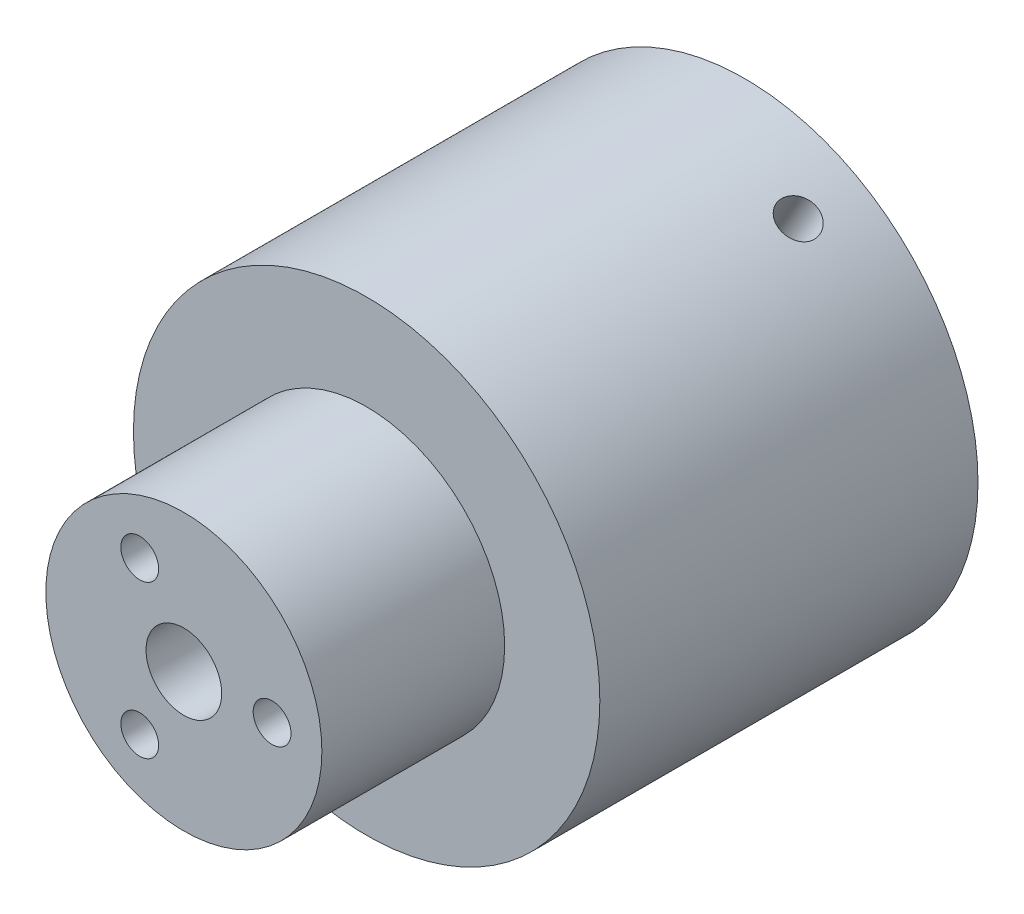
ISO-10303-21;
HEADER;
FILE_DESCRIPTION(('STEP AP214'),'2;1');
FILE_NAME('part.step','',(''),(''),'','','');
FILE_SCHEMA(('AUTOMOTIVE_DESIGN { 1 0 10303 214 1 1 1 1 }'));
ENDSEC;
DATA;
#1=APPLICATION_CONTEXT('core data for automotive mechanical design processes');
#2=APPLICATION_PROTOCOL_DEFINITION('international standard','automotive_design',2000,#1);
#3=PRODUCT_CONTEXT('',#1,'mechanical');
#4=PRODUCT('Part','Part','',(#3));
#5=PRODUCT_RELATED_PRODUCT_CATEGORY('part','',(#4));
#6=PRODUCT_DEFINITION_FORMATION('','',#4);
#7=PRODUCT_DEFINITION_CONTEXT('part definition',#1,'design');
#8=PRODUCT_DEFINITION('design','',#6,#7);
#9=PRODUCT_DEFINITION_SHAPE('','',#8);
#10=(LENGTH_UNIT() NAMED_UNIT(*) SI_UNIT(.MILLI.,.METRE.));
#11=(NAMED_UNIT(*) PLANE_ANGLE_UNIT() SI_UNIT($,.RADIAN.));
#12=(NAMED_UNIT(*) SI_UNIT($,.STERADIAN.) SOLID_ANGLE_UNIT());
#13=UNCERTAINTY_MEASURE_WITH_UNIT(LENGTH_MEASURE(1.E-05),#10,'distance_accuracy_value','');
#14=(GEOMETRIC_REPRESENTATION_CONTEXT(3) GLOBAL_UNCERTAINTY_ASSIGNED_CONTEXT((#13)) GLOBAL_UNIT_ASSIGNED_CONTEXT((#10,
#11,#12)) REPRESENTATION_CONTEXT('',''));
#15=CARTESIAN_POINT('',(0.,0.,0.));
#16=DIRECTION('',(0.,0.,1.));
#17=DIRECTION('',(1.,0.,0.));
#18=AXIS2_PLACEMENT_3D('',#15,#16,#17);
#19=CARTESIAN_POINT('',(-3.49999999999994,6.06217782649111,0.));
#20=DIRECTION('',(0.,0.,1.));
#21=DIRECTION('',(1.,0.,0.));
#22=AXIS2_PLACEMENT_3D('',#19,#20,#21);
#23=CYLINDRICAL_SURFACE('',#22,1.5);
#24=CARTESIAN_POINT('',(-3.49999999999994,6.06217782649111,37.5));
#25=DIRECTION('',(0.,0.,1.));
#26=DIRECTION('',(1.,0.,0.));
#27=AXIS2_PLACEMENT_3D('',#24,#25,#26);
#28=CIRCLE('',#27,1.5);
#29=CARTESIAN_POINT('',(-1.99999999999994,6.06217782649111,37.5));
#30=VERTEX_POINT('',#29);
#31=EDGE_CURVE('E183',#30,#30,#28,.T.);
#32=ORIENTED_EDGE('',*,*,#31,.T.);
#33=EDGE_LOOP('',(#32));
#34=FACE_BOUND('',#33,.T.);
#35=CARTESIAN_POINT('',(-3.49999999999994,6.06217782649111,30.));
#36=DIRECTION('',(0.,0.,-1.));
#37=DIRECTION('',(-1.,0.,0.));
#38=AXIS2_PLACEMENT_3D('',#35,#36,#37);
#39=CIRCLE('',#38,1.5);
#40=CARTESIAN_POINT('',(-4.99999999999994,6.06217782649111,30.));
#41=VERTEX_POINT('',#40);
#42=EDGE_CURVE('E70',#41,#41,#39,.F.);
#43=ORIENTED_EDGE('',*,*,#42,.F.);
#44=EDGE_LOOP('',(#43));
#45=FACE_BOUND('',#44,.T.);
#46=ADVANCED_FACE('F40',(#34,#45),#23,.F.);
#47=CARTESIAN_POINT('',(-3.50000000000003,-6.06217782649106,0.));
#48=DIRECTION('',(0.,0.,1.));
#49=DIRECTION('',(1.,0.,0.));
#50=AXIS2_PLACEMENT_3D('',#47,#48,#49);
#51=CYLINDRICAL_SURFACE('',#50,1.5);
#52=CARTESIAN_POINT('',(-3.50000000000003,-6.06217782649106,37.5));
#53=DIRECTION('',(0.,0.,1.));
#54=DIRECTION('',(1.,0.,0.));
#55=AXIS2_PLACEMENT_3D('',#52,#53,#54);
#56=CIRCLE('',#55,1.5);
#57=CARTESIAN_POINT('',(-2.00000000000003,-6.06217782649106,37.5));
#58=VERTEX_POINT('',#57);
#59=EDGE_CURVE('E188',#58,#58,#56,.T.);
#60=ORIENTED_EDGE('',*,*,#59,.T.);
#61=EDGE_LOOP('',(#60));
#62=FACE_BOUND('',#61,.T.);
#63=CARTESIAN_POINT('',(-3.50000000000003,-6.06217782649106,30.));
#64=DIRECTION('',(0.,0.,-1.));
#65=DIRECTION('',(-1.,0.,0.));
#66=AXIS2_PLACEMENT_3D('',#63,#64,#65);
#67=CIRCLE('',#66,1.5);
#68=CARTESIAN_POINT('',(-5.00000000000003,-6.06217782649106,30.));
#69=VERTEX_POINT('',#68);
#70=EDGE_CURVE('E66',#69,#69,#67,.F.);
#71=ORIENTED_EDGE('',*,*,#70,.F.);
#72=EDGE_LOOP('',(#71));
#73=FACE_BOUND('',#72,.T.);
#74=ADVANCED_FACE('F126',(#62,#73),#51,.F.);
#75=CARTESIAN_POINT('',(7.,0.,0.));
#76=DIRECTION('',(0.,0.,1.));
#77=DIRECTION('',(1.,0.,0.));
#78=AXIS2_PLACEMENT_3D('',#75,#76,#77);
#79=CYLINDRICAL_SURFACE('',#78,1.5);
#80=CARTESIAN_POINT('',(7.,0.,37.5));
#81=DIRECTION('',(0.,0.,1.));
#82=DIRECTION('',(1.,0.,0.));
#83=AXIS2_PLACEMENT_3D('',#80,#81,#82);
#84=CIRCLE('',#83,1.5);
#85=CARTESIAN_POINT('',(8.5,0.,37.5));
#86=VERTEX_POINT('',#85);
#87=EDGE_CURVE('E184',#86,#86,#84,.T.);
#88=ORIENTED_EDGE('',*,*,#87,.T.);
#89=EDGE_LOOP('',(#88));
#90=FACE_BOUND('',#89,.T.);
#91=CARTESIAN_POINT('',(7.,0.,30.));
#92=DIRECTION('',(0.,0.,-1.));
#93=DIRECTION('',(-1.,0.,0.));
#94=AXIS2_PLACEMENT_3D('',#91,#92,#93);
#95=CIRCLE('',#94,1.5);
#96=CARTESIAN_POINT('',(5.5,0.,30.));
#97=VERTEX_POINT('',#96);
#98=EDGE_CURVE('E63',#97,#97,#95,.F.);
#99=ORIENTED_EDGE('',*,*,#98,.F.);
#100=EDGE_LOOP('',(#99));
#101=FACE_BOUND('',#100,.T.);
#102=ADVANCED_FACE('F123',(#90,#101),#79,.F.);
#103=CARTESIAN_POINT('',(0.,0.,23.));
#104=DIRECTION('',(0.,0.,-1.));
#105=DIRECTION('',(-1.,0.,0.));
#106=AXIS2_PLACEMENT_3D('',#103,#104,#105);
#107=CYLINDRICAL_SURFACE('',#106,18.5);
#108=CARTESIAN_POINT('',(7.92050635161631,-16.7187194226713,-2.));
#109=CARTESIAN_POINT('',(7.920509940493,-16.7187182836103,-1.91589305238285));
#110=CARTESIAN_POINT('',(7.92694403159106,-16.7156742636564,-1.83172864688561));
#111=CARTESIAN_POINT('',(7.95249244942322,-16.7035342412793,-1.66572797712148));
#112=CARTESIAN_POINT('',(7.9716211916323,-16.6944313586494,-1.58389447002247));
#113=CARTESIAN_POINT('',(8.0219311386824,-16.6703147645035,-1.42498390631009));
#114=CARTESIAN_POINT('',(8.05310556804115,-16.6553043757654,-1.34790420398026));
#115=CARTESIAN_POINT('',(8.12650110386516,-16.6196160290497,-1.20064883417398));
#116=CARTESIAN_POINT('',(8.16871982826437,-16.5989392931607,-1.13047168242074));
#117=CARTESIAN_POINT('',(8.26298202865537,-16.5522171582038,-0.998823863895051));
#118=CARTESIAN_POINT('',(8.31504653305869,-16.5261602571446,-0.937372334215012));
#119=CARTESIAN_POINT('',(8.42732993336261,-16.4691853276837,-0.825084489746075));
#120=CARTESIAN_POINT('',(8.48754918334156,-16.4382670881938,-0.774248636132708));
#121=CARTESIAN_POINT('',(8.61439315523093,-16.3721515046297,-0.684571953396852));
#122=CARTESIAN_POINT('',(8.68102652188289,-16.3369483681291,-0.645747618398881));
#123=CARTESIAN_POINT('',(8.81862225676852,-16.2630867948194,-0.581301563704662));
#124=CARTESIAN_POINT('',(8.88958455280365,-16.2244284156325,-0.555679623884151));
#125=CARTESIAN_POINT('',(9.03357297272146,-16.1446992272974,-0.518420583859927));
#126=CARTESIAN_POINT('',(9.10659417234366,-16.1036339564812,-0.506752605386653));
#127=CARTESIAN_POINT('',(9.25272916089057,-16.0201149957479,-0.497637255511902));
#128=CARTESIAN_POINT('',(9.32584294815306,-15.9776613304262,-0.500189632332508));
#129=CARTESIAN_POINT('',(9.46991615707652,-15.8926922867784,-0.519417262399528));
#130=CARTESIAN_POINT('',(9.54088023810902,-15.8501772879836,-0.536059309799018));
#131=CARTESIAN_POINT('',(9.67888062735782,-15.7662866552721,-0.582942254568614));
#132=CARTESIAN_POINT('',(9.74591689989028,-15.7249110317084,-0.613183275462702));
#133=CARTESIAN_POINT('',(9.87434542109148,-15.6445854015982,-0.686442816683035));
#134=CARTESIAN_POINT('',(9.9357309814641,-15.6056382866286,-0.729476230001792));
#135=CARTESIAN_POINT('',(10.0511746963178,-15.5315356607769,-0.827088180090581));
#136=CARTESIAN_POINT('',(10.105232710188,-15.4963802226572,-0.881666938356818));
#137=CARTESIAN_POINT('',(10.2047926465065,-15.4310003661968,-1.00100748557717));
#138=CARTESIAN_POINT('',(10.2502695011575,-15.4007904279779,-1.06579812433811));
#139=CARTESIAN_POINT('',(10.331331866677,-15.3465295388471,-1.20362265870703));
#140=CARTESIAN_POINT('',(10.3669173700086,-15.3224785926281,-1.27665656059611));
#141=CARTESIAN_POINT('',(10.4273143197703,-15.281441555506,-1.42891454938799));
#142=CARTESIAN_POINT('',(10.4521245367051,-15.2644562708273,-1.50813934147531));
#143=CARTESIAN_POINT('',(10.4903467812982,-15.2382140238459,-1.67052066634596));
#144=CARTESIAN_POINT('',(10.5037590356439,-15.2289569078422,-1.75367712090002));
#145=CARTESIAN_POINT('',(10.5188301381156,-15.2185511087797,-1.92130804135632));
#146=CARTESIAN_POINT('',(10.5205223105851,-15.2173794359771,-2.00577808529532));
#147=CARTESIAN_POINT('',(10.5121995978079,-15.2231299082596,-2.17386086811142));
#148=CARTESIAN_POINT('',(10.5021848158491,-15.2300519819355,-2.25747361454572));
#149=CARTESIAN_POINT('',(10.47071850858,-15.2517020055878,-2.42135270374156));
#150=CARTESIAN_POINT('',(10.4492825572841,-15.2664193257319,-2.50162344337553));
#151=CARTESIAN_POINT('',(10.3955129021972,-15.3030834877141,-2.65667606888866));
#152=CARTESIAN_POINT('',(10.3631790327212,-15.3250304394668,-2.73145787129651));
#153=CARTESIAN_POINT('',(10.2883270996331,-15.3753815193488,-2.87359459297397));
#154=CARTESIAN_POINT('',(10.245786286936,-15.4038000639659,-2.94093242445872));
#155=CARTESIAN_POINT('',(10.1516190510955,-15.4660210479399,-3.0660970962305));
#156=CARTESIAN_POINT('',(10.0999924798696,-15.4998235750457,-3.12392378147214));
#157=CARTESIAN_POINT('',(9.9888272479967,-15.5716958909536,-3.22856224316261));
#158=CARTESIAN_POINT('',(9.92927027750794,-15.6097755219709,-3.27534781296246));
#159=CARTESIAN_POINT('',(9.80388522466343,-15.6888278642772,-3.35639621977992));
#160=CARTESIAN_POINT('',(9.73805720210339,-15.7298005479795,-3.39065917618804));
#161=CARTESIAN_POINT('',(9.60197050185944,-15.8132387544076,-3.44564467919343));
#162=CARTESIAN_POINT('',(9.53171725374305,-15.8557024204877,-3.46638347770085));
#163=CARTESIAN_POINT('',(9.38864013639583,-15.940839470571,-3.49378509166462));
#164=CARTESIAN_POINT('',(9.31581631299369,-15.9835128508236,-3.50044815793696));
#165=CARTESIAN_POINT('',(9.1698661448514,-16.0676890630386,-3.49950630926112));
#166=CARTESIAN_POINT('',(9.09674126656109,-16.1091949008849,-3.49194225635862));
#167=CARTESIAN_POINT('',(8.95208489584881,-16.19002914799,-3.46284603750625));
#168=CARTESIAN_POINT('',(8.88055340568351,-16.2293575541651,-3.44131385177489));
#169=CARTESIAN_POINT('',(8.74118322236748,-16.3048459586161,-3.38490284718542));
#170=CARTESIAN_POINT('',(8.67334434310311,-16.341006116633,-3.35002470169831));
#171=CARTESIAN_POINT('',(8.54337335935332,-16.4093317679929,-3.26791659890986));
#172=CARTESIAN_POINT('',(8.48124115766924,-16.441497329377,-3.22068685203921));
#173=CARTESIAN_POINT('',(8.3643953745659,-16.5012489116383,-3.11506295314024));
#174=CARTESIAN_POINT('',(8.3097025545615,-16.5288221627443,-3.05663861029896));
#175=CARTESIAN_POINT('',(8.20961014796169,-16.5787646995041,-2.93033750255217));
#176=CARTESIAN_POINT('',(8.16421281796173,-16.6011327217036,-2.86245844910254));
#177=CARTESIAN_POINT('',(8.08408209713078,-16.6403009474743,-2.71904972320095));
#178=CARTESIAN_POINT('',(8.04936799305311,-16.6570910854131,-2.6435065374776));
#179=CARTESIAN_POINT('',(7.99185990263305,-16.6847596075977,-2.48706416249895));
#180=CARTESIAN_POINT('',(7.96905218069001,-16.6956448045514,-2.4061712668252));
#181=CARTESIAN_POINT('',(7.94191399298116,-16.708564625058,-2.27066576296071));
#182=CARTESIAN_POINT('',(7.93389792917545,-16.712369648398,-2.21692522868833));
#183=CARTESIAN_POINT('',(7.92319295433397,-16.7174474124593,-2.1087978108073));
#184=CARTESIAN_POINT('',(7.92050402988047,-16.7187201595589,-2.05441092882698));
#185=CARTESIAN_POINT('',(7.92050635161631,-16.7187194226713,-2.));
#186=B_SPLINE_CURVE_WITH_KNOTS('',3,(#108,#109,#110,#111,#112,#113,#114,#115,#116,#117,#118,
#119,#120,#121,#122,#123,#124,#125,#126,#127,#128,#129,#130,#131,#132,#133,#134,#135,#136,#137,
#138,#139,#140,#141,#142,#143,#144,#145,#146,#147,#148,#149,#150,#151,#152,#153,#154,#155,#156,
#157,#158,#159,#160,#161,#162,#163,#164,#165,#166,#167,#168,#169,#170,#171,#172,#173,#174,#175,
#176,#177,#178,#179,#180,#181,#182,#183,#184,#185),.UNSPECIFIED.,.T.,.F.,(4,2,2,2,2,2,2,2,2,2,2,
2,2,2,2,2,2,2,2,2,2,2,2,2,2,2,2,2,2,2,2,2,2,2,2,2,2,2,4),(0.,0.252122182136554,
0.504531153893085,0.756798356335798,1.00901119384165,1.26176891370995,1.514537611818,
1.76765188493349,2.02076193772417,2.2733108489173,2.52585528863026,2.7778061954557,
3.02975939088097,3.28200706847211,3.53425958584686,3.78723796107974,4.04021652907545,
4.2932239551731,4.54622634923481,4.79850907147351,5.05078956789491,5.30272692938966,
5.55466812134959,5.80717613928723,6.05968827306149,6.31279386103382,6.56589703583611,
6.81869549463585,7.07148944877263,7.32355845589836,7.57562782000174,7.82768446761067,
8.07973682128258,8.33247875663575,8.58528197567228,8.83853894639373,9.09150310212679,
9.25460778074668,9.41771204854603),.UNSPECIFIED.);
#187=CARTESIAN_POINT('',(7.92050635161631,-16.7187194226713,-2.));
#188=VERTEX_POINT('',#187);
#189=EDGE_CURVE('E45',#188,#188,#186,.T.);
#190=ORIENTED_EDGE('',*,*,#189,.T.);
#191=EDGE_LOOP('',(#190));
#192=FACE_BOUND('',#191,.T.);
#193=CARTESIAN_POINT('',(10.5185825629694,15.2187194226714,-2.));
#194=CARTESIAN_POINT('',(10.5185797820753,15.2187219611993,-1.91589305238285));
#195=CARTESIAN_POINT('',(10.5127265379166,15.2227720375635,-1.83172864688561));
#196=CARTESIAN_POINT('',(10.4894387612194,15.2388276052441,-1.66572797712148));
#197=CARTESIAN_POINT('',(10.4719910625097,15.2508421406247,-1.58389447002247));
#198=CARTESIAN_POINT('',(10.4259505058016,15.2823535357602,-1.42498390631009));
#199=CARTESIAN_POINT('',(10.3973639131543,15.3018461891643,-1.34790420398026));
#200=CARTESIAN_POINT('',(10.3297591303674,15.3475644143544,-1.20064883417398));
#201=CARTESIAN_POINT('',(10.2907431896206,15.373788534255,-1.13047168242074));
#202=CARTESIAN_POINT('',(10.2031495336334,15.4320609269318,-0.998823863895052));
#203=CARTESIAN_POINT('',(10.1545513431705,15.4641216598509,-0.937372334215012));
#204=CARTESIAN_POINT('',(10.0490679067266,15.5328744722069,-0.825084489746075));
#205=CARTESIAN_POINT('',(9.99218230089864,15.5695667527406,-0.774248636132708));
#206=CARTESIAN_POINT('',(9.87150254000142,15.6463590629317,-0.684571953396852));
#207=CARTESIAN_POINT('',(9.80769904617297,15.6864636829416,-0.645747618398881));
#208=CARTESIAN_POINT('',(9.67493517988051,15.7686942981501,-0.581301563704663));
#209=CARTESIAN_POINT('',(9.60597489341794,15.810820259634,-0.555679623884151));
#210=CARTESIAN_POINT('',(9.46493318093773,15.895653294966,-0.518420583859926));
#211=CARTESIAN_POINT('',(9.39285901338653,15.9383588734456,-0.506752605386652));
#212=CARTESIAN_POINT('',(9.24746197742036,16.0231560055423,-0.497637255511902));
#213=CARTESIAN_POINT('',(9.17413913113674,16.0652475700176,-0.500189632332508));
#214=CARTESIAN_POINT('',(9.02851717634079,16.1475341071262,-0.519417262399528));
#215=CARTESIAN_POINT('',(8.95621606682639,16.1877333046592,-0.536059309799018));
#216=CARTESIAN_POINT('',(8.81456445313428,16.265299831125,-0.582942254568613));
#217=CARTESIAN_POINT('',(8.74521397576441,16.3026671343313,-0.613183275462701));
#218=CARTESIAN_POINT('',(8.6114356789134,16.3737266812069,-0.686442816683035));
#219=CARTESIAN_POINT('',(8.54701370775933,16.4074145784304,-0.729476230001792));
#220=CARTESIAN_POINT('',(8.42511709385775,16.470340455275,-0.827088180090581));
#221=CARTESIAN_POINT('',(8.3676425844298,16.499578349505,-0.881666938356817));
#222=CARTESIAN_POINT('',(8.26124199968003,16.5531098553257,-1.00100748557716));
#223=CARTESIAN_POINT('',(8.21234099841028,16.5773889976282,-1.06579812433811));
#224=CARTESIAN_POINT('',(8.12481850723128,16.6204606208936,-1.20362265870703));
#225=CARTESIAN_POINT('',(8.08619702515477,16.6392530976757,-1.27665656059611));
#226=CARTESIAN_POINT('',(8.02045943363014,16.6710398719194,-1.42891454938799));
#227=CARTESIAN_POINT('',(7.9933446371405,16.684033507719,-1.50813934147531));
#228=CARTESIAN_POINT('',(7.95150706230569,16.7040138190355,-1.67052066634596));
#229=CARTESIAN_POINT('',(7.93678403750782,16.7110006140191,-1.75367712090002));
#230=CARTESIAN_POINT('',(7.92023679993723,16.7188496720914,-1.92130804135632));
#231=CARTESIAN_POINT('',(7.91837601529046,16.7197293000362,-2.00577808529532));
#232=CARTESIAN_POINT('',(7.92751742675949,16.7153968554841,-2.17386086811143));
#233=CARTESIAN_POINT('',(7.93851950938908,16.7101848367323,-2.25747361454572));
#234=CARTESIAN_POINT('',(7.97300213349905,16.6937592271001,-2.42135270374156));
#235=CARTESIAN_POINT('',(7.99646568226737,16.6825538087956,-2.50162344337553));
#236=CARTESIAN_POINT('',(8.05510260549592,16.6543200025287,-2.65667606888866));
#237=CARTESIAN_POINT('',(8.09027615798736,16.6372915260363,-2.73145787129651));
#238=CARTESIAN_POINT('',(8.17130743881718,16.5976433904006,-2.87359459297397));
#239=CARTESIAN_POINT('',(8.21718902674273,16.5750112382158,-2.94093242445872));
#240=CARTESIAN_POINT('',(8.31815759743289,16.5245705117608,-3.0660970962305));
#241=CARTESIAN_POINT('',(8.37324473023163,16.4967618531218,-3.12392378147214));
#242=CARTESIAN_POINT('',(8.49107059757317,16.4364260962562,-3.22856224316261));
#243=CARTESIAN_POINT('',(8.55382701064521,16.4038880623491,-3.27534781296246));
#244=CARTESIAN_POINT('',(8.68498087373343,16.3348275924841,-3.35639621977992));
#245=CARTESIAN_POINT('',(8.75337826996087,16.2983051945173,-3.39065917618804));
#246=CARTESIAN_POINT('',(8.89368122649581,16.2221697582029,-3.44564467919343));
#247=CARTESIAN_POINT('',(8.9655824641172,16.1825604936758,-3.46638347770085));
#248=CARTESIAN_POINT('',(9.11085187096617,16.1012206003945,-3.49378509166462));
#249=CARTESIAN_POINT('',(9.18422001403139,16.0594900094539,-3.50044815793696));
#250=CARTESIAN_POINT('',(9.33009383627505,15.9751815622635,-3.49950630926112));
#251=CARTESIAN_POINT('',(9.40260138540043,15.9326064789386,-3.49194225635862));
#252=CARTESIAN_POINT('',(9.54493408224539,15.8477475106351,-3.46284603750625));
#253=CARTESIAN_POINT('',(9.61475922616602,15.8054636260689,-3.44131385177489));
#254=CARTESIAN_POINT('',(9.74981919376976,15.7225097090126,-3.38490284718542));
#255=CARTESIAN_POINT('',(9.81505424884944,15.6818395952139,-3.35002470169831));
#256=CARTESIAN_POINT('',(9.93921149053217,15.6034442472117,-3.26791659890986));
#257=CARTESIAN_POINT('',(9.9981337846598,15.5657189628522,-3.2206868520392));
#258=CARTESIAN_POINT('',(10.1083030643661,15.4944033374903,-3.11506295314024));
#259=CARTESIAN_POINT('',(10.159528610291,15.4608245915149,-3.05663861029896));
#260=CARTESIAN_POINT('',(10.2528263191543,15.3991132930535,-2.93033750255217));
#261=CARTESIAN_POINT('',(10.2948962596115,15.3709820631093,-2.86245844910254));
#262=CARTESIAN_POINT('',(10.3688822985656,15.3211709361314,-2.71904972320095));
#263=CARTESIAN_POINT('',(10.4007800365924,15.2995027090999,-2.6435065374776));
#264=CARTESIAN_POINT('',(10.4534957248995,15.2635335029653,-2.48706416249895));
#265=CARTESIAN_POINT('',(10.4743264429581,15.2492240348371,-2.40617126682519));
#266=CARTESIAN_POINT('',(10.4990844295836,15.2321815851218,-2.27066576296071));
#267=CARTESIAN_POINT('',(10.5063877083609,15.2271419818977,-2.21692522868833));
#268=CARTESIAN_POINT('',(10.5161376684532,15.2204100837688,-2.1087978108073));
#269=CARTESIAN_POINT('',(10.5185843620007,15.218717780433,-2.05441092882698));
#270=CARTESIAN_POINT('',(10.5185825629694,15.2187194226714,-2.));
#271=B_SPLINE_CURVE_WITH_KNOTS('',3,(#193,#194,#195,#196,#197,#198,#199,#200,#201,#202,#203,
#204,#205,#206,#207,#208,#209,#210,#211,#212,#213,#214,#215,#216,#217,#218,#219,#220,#221,#222,
#223,#224,#225,#226,#227,#228,#229,#230,#231,#232,#233,#234,#235,#236,#237,#238,#239,#240,#241,
#242,#243,#244,#245,#246,#247,#248,#249,#250,#251,#252,#253,#254,#255,#256,#257,#258,#259,#260,
#261,#262,#263,#264,#265,#266,#267,#268,#269,#270),.UNSPECIFIED.,.T.,.F.,(4,2,2,2,2,2,2,2,2,2,2,
2,2,2,2,2,2,2,2,2,2,2,2,2,2,2,2,2,2,2,2,2,2,2,2,2,2,2,4),(0.,0.252122182136554,
0.504531153893085,0.756798356335799,1.00901119384165,1.26176891370994,1.514537611818,
1.76765188493349,2.02076193772417,2.2733108489173,2.52585528863026,2.7778061954557,
3.02975939088097,3.2820070684721,3.53425958584686,3.78723796107974,4.04021652907545,
4.2932239551731,4.54622634923481,4.79850907147351,5.05078956789491,5.30272692938966,
5.55466812134959,5.80717613928722,6.05968827306148,6.31279386103382,6.5658970358361,
6.81869549463585,7.07148944877263,7.32355845589836,7.57562782000174,7.82768446761067,
8.07973682128258,8.33247875663574,8.58528197567228,8.83853894639373,9.09150310212679,
9.25460778074668,9.41771204854603),.UNSPECIFIED.);
#272=CARTESIAN_POINT('',(10.5185825629694,15.2187194226714,-2.));
#273=VERTEX_POINT('',#272);
#274=EDGE_CURVE('E82',#273,#273,#271,.T.);
#275=ORIENTED_EDGE('',*,*,#274,.T.);
#276=EDGE_LOOP('',(#275));
#277=FACE_BOUND('',#276,.T.);
#278=CARTESIAN_POINT('',(-18.5,0.,-0.500000000000002));
#279=CARTESIAN_POINT('',(-18.4999992018386,-0.0841074600240858,-0.500003677126895));
#280=CARTESIAN_POINT('',(-18.49942031025,-0.168272376255621,-0.507097856961772));
#281=CARTESIAN_POINT('',(-18.4971666549999,-0.334274107221221,-0.535293808922716));
#282=CARTESIAN_POINT('',(-18.4954906456848,-0.416108165187959,-0.556411503564231));
#283=CARTESIAN_POINT('',(-18.4912321771331,-0.575019893548109,-0.612040302131251));
#284=CARTESIAN_POINT('',(-18.488650226645,-0.652100204992827,-0.64654389010083));
#285=CARTESIAN_POINT('',(-18.4828695305308,-0.799356594754252,-0.72795174726246));
#286=CARTESIAN_POINT('',(-18.4796709180124,-0.869534158112596,-0.774853341133831));
#287=CARTESIAN_POINT('',(-18.4730072385833,-1.00118150919002,-0.879848613224292));
#288=CARTESIAN_POINT('',(-18.4695416147041,-1.06263229082474,-0.937966088789517));
#289=CARTESIAN_POINT('',(-18.4627391922885,-1.17491869232043,-1.06369320005692));
#290=CARTESIAN_POINT('',(-18.4594023993818,-1.2257538487126,-1.13130324998106));
#291=CARTESIAN_POINT('',(-18.4532293906448,-1.31542980445019,-1.27421073449909));
#292=CARTESIAN_POINT('',(-18.4503938708621,-1.35425398103888,-1.34951863269072));
#293=CARTESIAN_POINT('',(-18.4455507283819,-1.41869970374439,-1.50561112922273));
#294=CARTESIAN_POINT('',(-18.4435430917625,-1.44432147188073,-1.58639563543936));
#295=CARTESIAN_POINT('',(-18.4405876379152,-1.48158015006174,-1.7509583551443));
#296=CARTESIAN_POINT('',(-18.4396374820103,-1.4932479244156,-1.83472953794888));
#297=CARTESIAN_POINT('',(-18.4388971512574,-1.50236275051092,-2.0030462829829));
#298=CARTESIAN_POINT('',(-18.4391069556935,-1.49981005621559,-2.08759183135603));
#299=CARTESIAN_POINT('',(-18.440660717717,-1.48058192581961,-2.25484600580532));
#300=CARTESIAN_POINT('',(-18.4420019829606,-1.46394001507811,-2.33755851457945));
#301=CARTESIAN_POINT('',(-18.4456633111963,-1.41705792947881,-2.49901236912521));
#302=CARTESIAN_POINT('',(-18.4479833833004,-1.38681762802737,-2.57775367791953));
#303=CARTESIAN_POINT('',(-18.4533440042758,-1.3135595716986,-2.7291369025526));
#304=CARTESIAN_POINT('',(-18.456385401562,-1.27052675518137,-2.80177149843279));
#305=CARTESIAN_POINT('',(-18.4628451854293,-1.17291607630135,-2.93879942206624));
#306=CARTESIAN_POINT('',(-18.4662635792315,-1.11833799277576,-3.00319259190761));
#307=CARTESIAN_POINT('',(-18.4731041550355,-0.998997921290517,-3.12210472497058));
#308=CARTESIAN_POINT('',(-18.4765263194163,-0.934206946496951,-3.17659460229634));
#309=CARTESIAN_POINT('',(-18.4829794102491,-0.796381456947068,-3.27392856181887));
#310=CARTESIAN_POINT('',(-18.4860103364576,-0.72334693706089,-3.31677263676854));
#311=CARTESIAN_POINT('',(-18.4913399763367,-0.571088786957947,-3.38959691604859));
#312=CARTESIAN_POINT('',(-18.4936386179699,-0.491864548790936,-3.4195758548911));
#313=CARTESIAN_POINT('',(-18.4972438513764,-0.329484427021322,-3.46579861992925));
#314=CARTESIAN_POINT('',(-18.4985504626397,-0.246328620694753,-3.48204271596854));
#315=CARTESIAN_POINT('',(-18.5000219120631,-0.078697992068915,-3.50029827017414));
#316=CARTESIAN_POINT('',(-18.5001899735125,0.00577242742720614,-3.50234990822105));
#317=CARTESIAN_POINT('',(-18.4993739916585,0.173856042607109,-3.49226753191298));
#318=CARTESIAN_POINT('',(-18.4983899585204,0.257469245847823,-3.4801336427215));
#319=CARTESIAN_POINT('',(-18.495382540036,0.421350558055178,-3.44205794682921));
#320=CARTESIAN_POINT('',(-18.4933605549502,0.501623016566481,-3.41613474105266));
#321=CARTESIAN_POINT('',(-18.4885044160699,0.656678872821625,-3.35123526186494));
#322=CARTESIAN_POINT('',(-18.4856702500991,0.731462188249673,-3.31225879275434));
#323=CARTESIAN_POINT('',(-18.4794995137225,0.873599925942357,-3.22225805364098));
#324=CARTESIAN_POINT('',(-18.4761618381982,0.940937428102478,-3.17120713873549));
#325=CARTESIAN_POINT('',(-18.4693628625451,1.06610133368472,-3.05854518129713));
#326=CARTESIAN_POINT('',(-18.4659015603836,1.12392758063525,-2.99693396506863));
#327=CARTESIAN_POINT('',(-18.4592359229661,1.22856511642573,-2.86472608670604));
#328=CARTESIAN_POINT('',(-18.4560322106203,1.27535020395855,-2.79410865147966));
#329=CARTESIAN_POINT('',(-18.4502531976971,1.35639776419443,-2.64599642528607));
#330=CARTESIAN_POINT('',(-18.4476778911333,1.39066035619648,-2.56850169984599));
#331=CARTESIAN_POINT('',(-18.4434506960258,1.44564561352028,-2.40892781502757));
#332=CARTESIAN_POINT('',(-18.4417977102096,1.46638437294225,-2.32685423153443));
#333=CARTESIAN_POINT('',(-18.4395985923444,1.49378568743103,-2.16037591293555));
#334=CARTESIAN_POINT('',(-18.4390524402998,1.5004484967879,-2.07597121997053));
#335=CARTESIAN_POINT('',(-18.439129098025,1.4995059076103,-1.90748701844209));
#336=CARTESIAN_POINT('',(-18.4397485348113,1.49194167933729,-1.82340727494692));
#337=CARTESIAN_POINT('',(-18.4420794105417,1.46284552444752,-1.65771645815518));
#338=CARTESIAN_POINT('',(-18.443790851196,1.44131357595534,-1.57610538872511));
#339=CARTESIAN_POINT('',(-18.4481120145893,1.38490349674601,-1.41766548330881));
#340=CARTESIAN_POINT('',(-18.4507216915667,1.35002604592053,-1.34083640393408));
#341=CARTESIAN_POINT('',(-18.4565453445918,1.26791970089686,-1.19411749893485));
#342=CARTESIAN_POINT('',(-18.459759310408,1.22069101582014,-1.12422755584993));
#343=CARTESIAN_POINT('',(-18.4664404468683,1.1150682747765,-0.993160271760562));
#344=CARTESIAN_POINT('',(-18.4699082913633,1.05664378585471,-0.932007490158073));
#345=CARTESIAN_POINT('',(-18.4767003111364,0.930342064543588,-0.820352140426872));
#346=CARTESIAN_POINT('',(-18.4800244514024,0.862462545344835,-0.769852156253509));
#347=CARTESIAN_POINT('',(-18.4861601929444,0.719053450028474,-0.680872027125138));
#348=CARTESIAN_POINT('',(-18.4889708694003,0.643510444069051,-0.642413483285792));
#349=CARTESIAN_POINT('',(-18.4937520078942,0.487068452403801,-0.578775370558669));
#350=CARTESIAN_POINT('',(-18.4957234374669,0.406175759180912,-0.553580502522848));
#351=CARTESIAN_POINT('',(-18.4980965732538,0.270669711012243,-0.523617652854907));
#352=CARTESIAN_POINT('',(-18.4988071182786,0.2169283889936,-0.514772765628119));
#353=CARTESIAN_POINT('',(-18.4997590892453,0.108799392427558,-0.502962757097846));
#354=CARTESIAN_POINT('',(-18.5000005163553,0.0544117194900214,-0.499997621152786));
#355=CARTESIAN_POINT('',(-18.5,0.,-0.500000000000002));
#356=B_SPLINE_CURVE_WITH_KNOTS('',3,(#278,#279,#280,#281,#282,#283,#284,#285,#286,#287,#288,
#289,#290,#291,#292,#293,#294,#295,#296,#297,#298,#299,#300,#301,#302,#303,#304,#305,#306,#307,
#308,#309,#310,#311,#312,#313,#314,#315,#316,#317,#318,#319,#320,#321,#322,#323,#324,#325,#326,
#327,#328,#329,#330,#331,#332,#333,#334,#335,#336,#337,#338,#339,#340,#341,#342,#343,#344,#345,
#346,#347,#348,#349,#350,#351,#352,#353,#354,#355),.UNSPECIFIED.,.T.,.F.,(4,2,2,2,2,2,2,2,2,2,2,
2,2,2,2,2,2,2,2,2,2,2,2,2,2,2,2,2,2,2,2,2,2,2,2,2,2,2,4),(0.,0.252123721168803,
0.504534198083481,0.75680315536181,1.00901772081216,1.26177342695931,1.51454016589054,
1.76765517578223,2.02076592900327,2.27331579457328,2.52586114987229,2.77780725581025,
3.02975570727832,3.28200198044324,3.53425308611153,3.78723348355258,4.04021403842129,
4.29321947219408,4.54621993514242,4.79850384117442,5.05078552124028,5.30272774893383,
5.55467375400919,5.80718100738505,6.05969241439369,6.31279715184359,6.56589947795907,
6.81870004610704,7.07149604722958,7.32356163154415,7.57562761062996,7.82768074982833,
8.07972962173552,8.33247360074612,8.58527881532491,8.83853497220858,9.09149836408137,
9.25460541012179,9.4177120499976),.UNSPECIFIED.);
#357=CARTESIAN_POINT('',(-18.5,0.,-0.500000000000002));
#358=VERTEX_POINT('',#357);
#359=EDGE_CURVE('E74',#358,#358,#356,.T.);
#360=ORIENTED_EDGE('',*,*,#359,.T.);
#361=EDGE_LOOP('',(#360));
#362=FACE_BOUND('',#361,.T.);
#363=CARTESIAN_POINT('',(0.,0.,23.));
#364=DIRECTION('',(0.,0.,1.));
#365=DIRECTION('',(1.,0.,0.));
#366=AXIS2_PLACEMENT_3D('',#363,#364,#365);
#367=CIRCLE('',#366,18.5);
#368=CARTESIAN_POINT('',(18.5,0.,23.));
#369=VERTEX_POINT('',#368);
#370=EDGE_CURVE('E53',#369,#369,#367,.T.);
#371=ORIENTED_EDGE('',*,*,#370,.F.);
#372=EDGE_LOOP('',(#371));
#373=FACE_BOUND('',#372,.T.);
#374=CARTESIAN_POINT('',(0.,0.,-7.));
#375=DIRECTION('',(0.,0.,-1.));
#376=DIRECTION('',(-1.,0.,0.));
#377=AXIS2_PLACEMENT_3D('',#374,#375,#376);
#378=CIRCLE('',#377,18.5);
#379=CARTESIAN_POINT('',(-18.5,0.,-7.));
#380=VERTEX_POINT('',#379);
#381=EDGE_CURVE('E164',#380,#380,#378,.T.);
#382=ORIENTED_EDGE('',*,*,#381,.F.);
#383=EDGE_LOOP('',(#382));
#384=FACE_BOUND('',#383,.T.);
#385=ADVANCED_FACE('F42',(#192,#277,#362,#373,#384),#107,.T.);
#386=CARTESIAN_POINT('',(0.,0.,23.));
#387=DIRECTION('',(0.,0.,1.));
#388=DIRECTION('',(1.,0.,0.));
#389=AXIS2_PLACEMENT_3D('',#386,#387,#388);
#390=PLANE('',#389);
#391=CARTESIAN_POINT('',(0.,0.,23.));
#392=DIRECTION('',(0.,0.,1.));
#393=DIRECTION('',(1.,0.,0.));
#394=AXIS2_PLACEMENT_3D('',#391,#392,#393);
#395=CIRCLE('',#394,10.95);
#396=CARTESIAN_POINT('',(10.95,0.,23.));
#397=VERTEX_POINT('',#396);
#398=EDGE_CURVE('E11',#397,#397,#395,.T.);
#399=ORIENTED_EDGE('',*,*,#398,.F.);
#400=EDGE_LOOP('',(#399));
#401=FACE_BOUND('',#400,.T.);
#402=ORIENTED_EDGE('',*,*,#370,.T.);
#403=EDGE_LOOP('',(#402));
#404=FACE_BOUND('',#403,.T.);
#405=ADVANCED_FACE('F151',(#401,#404),#390,.T.);
#406=CARTESIAN_POINT('',(0.,0.,26.5));
#407=DIRECTION('',(0.,0.,-1.));
#408=DIRECTION('',(-1.,0.,0.));
#409=AXIS2_PLACEMENT_3D('',#406,#407,#408);
#410=CYLINDRICAL_SURFACE('',#409,10.95);
#411=ORIENTED_EDGE('',*,*,#398,.T.);
#412=EDGE_LOOP('',(#411));
#413=FACE_BOUND('',#412,.T.);
#414=CARTESIAN_POINT('',(0.,0.,37.5));
#415=DIRECTION('',(0.,0.,1.));
#416=DIRECTION('',(1.,0.,0.));
#417=AXIS2_PLACEMENT_3D('',#414,#415,#416);
#418=CIRCLE('',#417,10.95);
#419=CARTESIAN_POINT('',(10.95,0.,37.5));
#420=VERTEX_POINT('',#419);
#421=EDGE_CURVE('E194',#420,#420,#418,.T.);
#422=ORIENTED_EDGE('',*,*,#421,.F.);
#423=EDGE_LOOP('',(#422));
#424=FACE_BOUND('',#423,.T.);
#425=ADVANCED_FACE('F148',(#413,#424),#410,.T.);
#426=CARTESIAN_POINT('',(0.,0.,4.1));
#427=DIRECTION('',(0.,0.,-1.));
#428=DIRECTION('',(-1.,0.,0.));
#429=AXIS2_PLACEMENT_3D('',#426,#427,#428);
#430=CYLINDRICAL_SURFACE('',#429,3.05);
#431=CARTESIAN_POINT('',(0.,0.,4.1));
#432=DIRECTION('',(0.,0.,-1.));
#433=DIRECTION('',(-1.,0.,0.));
#434=AXIS2_PLACEMENT_3D('',#431,#432,#433);
#435=CIRCLE('',#434,3.05);
#436=CARTESIAN_POINT('',(-3.05,0.,4.1));
#437=VERTEX_POINT('',#436);
#438=EDGE_CURVE('E58',#437,#437,#435,.T.);
#439=ORIENTED_EDGE('',*,*,#438,.F.);
#440=EDGE_LOOP('',(#439));
#441=FACE_BOUND('',#440,.T.);
#442=CARTESIAN_POINT('',(0.,0.,-7.));
#443=DIRECTION('',(0.,0.,-1.));
#444=DIRECTION('',(-1.,0.,0.));
#445=AXIS2_PLACEMENT_3D('',#442,#443,#444);
#446=CIRCLE('',#445,3.05);
#447=CARTESIAN_POINT('',(-3.05,0.,-7.));
#448=VERTEX_POINT('',#447);
#449=EDGE_CURVE('E80',#448,#448,#446,.T.);
#450=ORIENTED_EDGE('',*,*,#449,.T.);
#451=EDGE_LOOP('',(#450));
#452=FACE_BOUND('',#451,.T.);
#453=ADVANCED_FACE('F144',(#441,#452),#430,.F.);
#454=CARTESIAN_POINT('',(0.,0.,4.1));
#455=DIRECTION('',(0.,0.,-1.));
#456=DIRECTION('',(-1.,0.,0.));
#457=AXIS2_PLACEMENT_3D('',#454,#455,#456);
#458=PLANE('',#457);
#459=CARTESIAN_POINT('',(0.,0.,4.1));
#460=DIRECTION('',(0.,0.,-1.));
#461=DIRECTION('',(-1.,0.,0.));
#462=AXIS2_PLACEMENT_3D('',#459,#460,#461);
#463=CIRCLE('',#462,3.);
#464=CARTESIAN_POINT('',(-3.,0.,4.1));
#465=VERTEX_POINT('',#464);
#466=EDGE_CURVE('E73',#465,#465,#463,.T.);
#467=ORIENTED_EDGE('',*,*,#466,.F.);
#468=EDGE_LOOP('',(#467));
#469=FACE_BOUND('',#468,.T.);
#470=ORIENTED_EDGE('',*,*,#438,.T.);
#471=EDGE_LOOP('',(#470));
#472=FACE_BOUND('',#471,.T.);
#473=ADVANCED_FACE('F140',(#469,#472),#458,.T.);
#474=CARTESIAN_POINT('',(0.,0.,37.5));
#475=DIRECTION('',(0.,0.,1.));
#476=DIRECTION('',(1.,0.,0.));
#477=AXIS2_PLACEMENT_3D('',#474,#475,#476);
#478=PLANE('',#477);
#479=ORIENTED_EDGE('',*,*,#87,.F.);
#480=EDGE_LOOP('',(#479));
#481=FACE_BOUND('',#480,.T.);
#482=ORIENTED_EDGE('',*,*,#59,.F.);
#483=EDGE_LOOP('',(#482));
#484=FACE_BOUND('',#483,.T.);
#485=ORIENTED_EDGE('',*,*,#31,.F.);
#486=EDGE_LOOP('',(#485));
#487=FACE_BOUND('',#486,.T.);
#488=ORIENTED_EDGE('',*,*,#421,.T.);
#489=EDGE_LOOP('',(#488));
#490=FACE_BOUND('',#489,.T.);
#491=CARTESIAN_POINT('',(0.,0.,37.5));
#492=DIRECTION('',(0.,0.,1.));
#493=DIRECTION('',(1.,0.,0.));
#494=AXIS2_PLACEMENT_3D('',#491,#492,#493);
#495=CIRCLE('',#494,3.);
#496=CARTESIAN_POINT('',(3.,0.,37.5));
#497=VERTEX_POINT('',#496);
#498=EDGE_CURVE('E187',#497,#497,#495,.T.);
#499=ORIENTED_EDGE('',*,*,#498,.F.);
#500=EDGE_LOOP('',(#499));
#501=FACE_BOUND('',#500,.T.);
#502=ADVANCED_FACE('F136',(#481,#484,#487,#490,#501),#478,.T.);
#503=CARTESIAN_POINT('',(0.,0.,37.5));
#504=DIRECTION('',(0.,0.,-1.));
#505=DIRECTION('',(-1.,0.,0.));
#506=AXIS2_PLACEMENT_3D('',#503,#504,#505);
#507=CYLINDRICAL_SURFACE('',#506,3.);
#508=ORIENTED_EDGE('',*,*,#498,.T.);
#509=EDGE_LOOP('',(#508));
#510=FACE_BOUND('',#509,.T.);
#511=ORIENTED_EDGE('',*,*,#466,.T.);
#512=EDGE_LOOP('',(#511));
#513=FACE_BOUND('',#512,.T.);
#514=ADVANCED_FACE('F111',(#510,#513),#507,.F.);
#515=CARTESIAN_POINT('',(7.,0.,30.));
#516=DIRECTION('',(0.,0.,-1.));
#517=DIRECTION('',(-1.,0.,0.));
#518=AXIS2_PLACEMENT_3D('',#515,#516,#517);
#519=PLANE('',#518);
#520=CARTESIAN_POINT('',(7.,0.,30.));
#521=DIRECTION('',(0.,0.,-1.));
#522=DIRECTION('',(-1.,0.,0.));
#523=AXIS2_PLACEMENT_3D('',#520,#521,#522);
#524=CIRCLE('',#523,3.25);
#525=CARTESIAN_POINT('',(3.75,0.,30.));
#526=VERTEX_POINT('',#525);
#527=EDGE_CURVE('E166',#526,#526,#524,.T.);
#528=ORIENTED_EDGE('',*,*,#527,.T.);
#529=EDGE_LOOP('',(#528));
#530=FACE_BOUND('',#529,.T.);
#531=ORIENTED_EDGE('',*,*,#98,.T.);
#532=EDGE_LOOP('',(#531));
#533=FACE_BOUND('',#532,.T.);
#534=ADVANCED_FACE('F107',(#530,#533),#519,.T.);
#535=CARTESIAN_POINT('',(7.,0.,30.));
#536=DIRECTION('',(0.,0.,-1.));
#537=DIRECTION('',(-1.,0.,0.));
#538=AXIS2_PLACEMENT_3D('',#535,#536,#537);
#539=CYLINDRICAL_SURFACE('',#538,3.25);
#540=ORIENTED_EDGE('',*,*,#527,.F.);
#541=EDGE_LOOP('',(#540));
#542=FACE_BOUND('',#541,.T.);
#543=CARTESIAN_POINT('',(7.,0.,-7.));
#544=DIRECTION('',(0.,0.,-1.));
#545=DIRECTION('',(-1.,0.,0.));
#546=AXIS2_PLACEMENT_3D('',#543,#544,#545);
#547=CIRCLE('',#546,3.25);
#548=CARTESIAN_POINT('',(3.75,0.,-7.));
#549=VERTEX_POINT('',#548);
#550=EDGE_CURVE('E205',#549,#549,#547,.T.);
#551=ORIENTED_EDGE('',*,*,#550,.T.);
#552=EDGE_LOOP('',(#551));
#553=FACE_BOUND('',#552,.T.);
#554=ADVANCED_FACE('F110',(#542,#553),#539,.F.);
#555=CARTESIAN_POINT('',(-3.50000000000003,-6.06217782649106,30.));
#556=DIRECTION('',(0.,0.,-1.));
#557=DIRECTION('',(-1.,0.,0.));
#558=AXIS2_PLACEMENT_3D('',#555,#556,#557);
#559=PLANE('',#558);
#560=CARTESIAN_POINT('',(-3.50000000000003,-6.06217782649106,30.));
#561=DIRECTION('',(0.,0.,-1.));
#562=DIRECTION('',(-1.,0.,0.));
#563=AXIS2_PLACEMENT_3D('',#560,#561,#562);
#564=CIRCLE('',#563,3.25);
#565=CARTESIAN_POINT('',(-6.75000000000003,-6.06217782649106,30.));
#566=VERTEX_POINT('',#565);
#567=EDGE_CURVE('E67',#566,#566,#564,.T.);
#568=ORIENTED_EDGE('',*,*,#567,.T.);
#569=EDGE_LOOP('',(#568));
#570=FACE_BOUND('',#569,.T.);
#571=ORIENTED_EDGE('',*,*,#70,.T.);
#572=EDGE_LOOP('',(#571));
#573=FACE_BOUND('',#572,.T.);
#574=ADVANCED_FACE('F115',(#570,#573),#559,.T.);
#575=CARTESIAN_POINT('',(-3.50000000000003,-6.06217782649106,30.));
#576=DIRECTION('',(0.,0.,-1.));
#577=DIRECTION('',(-1.,0.,0.));
#578=AXIS2_PLACEMENT_3D('',#575,#576,#577);
#579=CYLINDRICAL_SURFACE('',#578,3.25);
#580=ORIENTED_EDGE('',*,*,#567,.F.);
#581=EDGE_LOOP('',(#580));
#582=FACE_BOUND('',#581,.T.);
#583=CARTESIAN_POINT('',(-3.50000000000003,-6.06217782649106,-7.));
#584=DIRECTION('',(0.,0.,-1.));
#585=DIRECTION('',(-1.,0.,0.));
#586=AXIS2_PLACEMENT_3D('',#583,#584,#585);
#587=CIRCLE('',#586,3.25);
#588=CARTESIAN_POINT('',(-6.75000000000003,-6.06217782649106,-7.));
#589=VERTEX_POINT('',#588);
#590=EDGE_CURVE('E173',#589,#589,#587,.T.);
#591=ORIENTED_EDGE('',*,*,#590,.T.);
#592=EDGE_LOOP('',(#591));
#593=FACE_BOUND('',#592,.T.);
#594=ADVANCED_FACE('F102',(#582,#593),#579,.F.);
#595=CARTESIAN_POINT('',(-3.49999999999994,6.06217782649111,30.));
#596=DIRECTION('',(0.,0.,-1.));
#597=DIRECTION('',(-1.,0.,0.));
#598=AXIS2_PLACEMENT_3D('',#595,#596,#597);
#599=PLANE('',#598);
#600=CARTESIAN_POINT('',(-3.49999999999994,6.06217782649111,30.));
#601=DIRECTION('',(0.,0.,-1.));
#602=DIRECTION('',(-1.,0.,0.));
#603=AXIS2_PLACEMENT_3D('',#600,#601,#602);
#604=CIRCLE('',#603,3.25);
#605=CARTESIAN_POINT('',(-6.74999999999994,6.06217782649111,30.));
#606=VERTEX_POINT('',#605);
#607=EDGE_CURVE('E170',#606,#606,#604,.T.);
#608=ORIENTED_EDGE('',*,*,#607,.T.);
#609=EDGE_LOOP('',(#608));
#610=FACE_BOUND('',#609,.T.);
#611=ORIENTED_EDGE('',*,*,#42,.T.);
#612=EDGE_LOOP('',(#611));
#613=FACE_BOUND('',#612,.T.);
#614=ADVANCED_FACE('F99',(#610,#613),#599,.T.);
#615=CARTESIAN_POINT('',(-3.49999999999994,6.06217782649111,30.));
#616=DIRECTION('',(0.,0.,-1.));
#617=DIRECTION('',(-1.,0.,0.));
#618=AXIS2_PLACEMENT_3D('',#615,#616,#617);
#619=CYLINDRICAL_SURFACE('',#618,3.25);
#620=ORIENTED_EDGE('',*,*,#607,.F.);
#621=EDGE_LOOP('',(#620));
#622=FACE_BOUND('',#621,.T.);
#623=CARTESIAN_POINT('',(-3.49999999999994,6.06217782649111,-7.));
#624=DIRECTION('',(0.,0.,-1.));
#625=DIRECTION('',(-1.,0.,0.));
#626=AXIS2_PLACEMENT_3D('',#623,#624,#625);
#627=CIRCLE('',#626,3.25);
#628=CARTESIAN_POINT('',(-6.74999999999994,6.06217782649111,-7.));
#629=VERTEX_POINT('',#628);
#630=EDGE_CURVE('E167',#629,#629,#627,.T.);
#631=ORIENTED_EDGE('',*,*,#630,.T.);
#632=EDGE_LOOP('',(#631));
#633=FACE_BOUND('',#632,.T.);
#634=ADVANCED_FACE('F97',(#622,#633),#619,.F.);
#635=CARTESIAN_POINT('',(0.,0.,-7.));
#636=DIRECTION('',(0.,0.,-1.));
#637=DIRECTION('',(-1.,0.,0.));
#638=AXIS2_PLACEMENT_3D('',#635,#636,#637);
#639=PLANE('',#638);
#640=ORIENTED_EDGE('',*,*,#550,.F.);
#641=EDGE_LOOP('',(#640));
#642=FACE_BOUND('',#641,.T.);
#643=ORIENTED_EDGE('',*,*,#630,.F.);
#644=EDGE_LOOP('',(#643));
#645=FACE_BOUND('',#644,.T.);
#646=ORIENTED_EDGE('',*,*,#381,.T.);
#647=EDGE_LOOP('',(#646));
#648=FACE_BOUND('',#647,.T.);
#649=ORIENTED_EDGE('',*,*,#590,.F.);
#650=EDGE_LOOP('',(#649));
#651=FACE_BOUND('',#650,.T.);
#652=ORIENTED_EDGE('',*,*,#449,.F.);
#653=EDGE_LOOP('',(#652));
#654=FACE_BOUND('',#653,.T.);
#655=ADVANCED_FACE('F93',(#642,#645,#648,#651,#654),#639,.T.);
#656=CARTESIAN_POINT('',(-22.,0.,-2.));
#657=DIRECTION('',(1.,0.,0.));
#658=DIRECTION('',(0.,0.,-1.));
#659=AXIS2_PLACEMENT_3D('',#656,#657,#658);
#660=CYLINDRICAL_SURFACE('',#659,1.5);
#661=CARTESIAN_POINT('',(-5.,0.,-2.));
#662=DIRECTION('',(1.,0.,0.));
#663=DIRECTION('',(0.,0.,-1.));
#664=AXIS2_PLACEMENT_3D('',#661,#662,#663);
#665=CIRCLE('',#664,1.5);
#666=CARTESIAN_POINT('',(-5.,0.,-3.5));
#667=VERTEX_POINT('',#666);
#668=EDGE_CURVE('E81',#667,#667,#665,.T.);
#669=ORIENTED_EDGE('',*,*,#668,.T.);
#670=EDGE_LOOP('',(#669));
#671=FACE_BOUND('',#670,.T.);
#672=ORIENTED_EDGE('',*,*,#359,.F.);
#673=EDGE_LOOP('',(#672));
#674=FACE_BOUND('',#673,.T.);
#675=ADVANCED_FACE('F87',(#671,#674),#660,.F.);
#676=CARTESIAN_POINT('',(-5.,0.,-2.));
#677=DIRECTION('',(1.,0.,0.));
#678=DIRECTION('',(0.,0.,-1.));
#679=AXIS2_PLACEMENT_3D('',#676,#677,#678);
#680=PLANE('',#679);
#681=ORIENTED_EDGE('',*,*,#668,.F.);
#682=EDGE_LOOP('',(#681));
#683=FACE_BOUND('',#682,.T.);
#684=ADVANCED_FACE('F92',(#683),#680,.F.);
#685=CARTESIAN_POINT('',(10.9999999999998,19.0525588832578,-2.));
#686=DIRECTION('',(-0.499999999999992,-0.866025403784443,0.));
#687=DIRECTION('',(0.866025403784443,-0.499999999999992,0.));
#688=AXIS2_PLACEMENT_3D('',#685,#686,#687);
#689=CYLINDRICAL_SURFACE('',#688,1.5);
#690=CARTESIAN_POINT('',(2.49999999999996,4.33012701892222,-2.));
#691=DIRECTION('',(-0.499999999999992,-0.866025403784443,0.));
#692=DIRECTION('',(0.,0.,-1.));
#693=AXIS2_PLACEMENT_3D('',#690,#691,#692);
#694=CIRCLE('',#693,1.5);
#695=CARTESIAN_POINT('',(2.49999999999996,4.33012701892222,-3.5));
#696=VERTEX_POINT('',#695);
#697=EDGE_CURVE('E216',#696,#696,#694,.T.);
#698=ORIENTED_EDGE('',*,*,#697,.T.);
#699=EDGE_LOOP('',(#698));
#700=FACE_BOUND('',#699,.T.);
#701=ORIENTED_EDGE('',*,*,#274,.F.);
#702=EDGE_LOOP('',(#701));
#703=FACE_BOUND('',#702,.T.);
#704=ADVANCED_FACE('F239',(#700,#703),#689,.F.);
#705=CARTESIAN_POINT('',(2.49999999999996,4.33012701892222,-2.));
#706=DIRECTION('',(-0.499999999999992,-0.866025403784443,0.));
#707=DIRECTION('',(0.,0.,-1.));
#708=AXIS2_PLACEMENT_3D('',#705,#706,#707);
#709=PLANE('',#708);
#710=ORIENTED_EDGE('',*,*,#697,.F.);
#711=EDGE_LOOP('',(#710));
#712=FACE_BOUND('',#711,.T.);
#713=ADVANCED_FACE('F232',(#712),#709,.F.);
#714=CARTESIAN_POINT('',(11.0000000000001,-19.0525588832576,-2.));
#715=DIRECTION('',(-0.500000000000004,0.866025403784436,0.));
#716=DIRECTION('',(-0.866025403784436,-0.500000000000004,0.));
#717=AXIS2_PLACEMENT_3D('',#714,#715,#716);
#718=CYLINDRICAL_SURFACE('',#717,1.5);
#719=CARTESIAN_POINT('',(2.50000000000002,-4.33012701892218,-2.));
#720=DIRECTION('',(-0.500000000000004,0.866025403784436,0.));
#721=DIRECTION('',(0.,0.,-1.));
#722=AXIS2_PLACEMENT_3D('',#719,#720,#721);
#723=CIRCLE('',#722,1.5);
#724=CARTESIAN_POINT('',(2.50000000000002,-4.33012701892218,-3.5));
#725=VERTEX_POINT('',#724);
#726=EDGE_CURVE('E219',#725,#725,#723,.T.);
#727=ORIENTED_EDGE('',*,*,#726,.T.);
#728=EDGE_LOOP('',(#727));
#729=FACE_BOUND('',#728,.T.);
#730=ORIENTED_EDGE('',*,*,#189,.F.);
#731=EDGE_LOOP('',(#730));
#732=FACE_BOUND('',#731,.T.);
#733=ADVANCED_FACE('F229',(#729,#732),#718,.F.);
#734=CARTESIAN_POINT('',(2.50000000000002,-4.33012701892218,-2.));
#735=DIRECTION('',(-0.500000000000004,0.866025403784436,0.));
#736=DIRECTION('',(0.,0.,-1.));
#737=AXIS2_PLACEMENT_3D('',#734,#735,#736);
#738=PLANE('',#737);
#739=ORIENTED_EDGE('',*,*,#726,.F.);
#740=EDGE_LOOP('',(#739));
#741=FACE_BOUND('',#740,.T.);
#742=ADVANCED_FACE('F231',(#741),#738,.F.);
#743=CLOSED_SHELL('',(#46,#74,#102,#385,#405,#425,#453,#473,#502,#514,#534,#554,#574,#594,#614,
#634,#655,#675,#684,#704,#713,#733,#742));
#744=MANIFOLD_SOLID_BREP('B2',#743);
#745=ADVANCED_BREP_SHAPE_REPRESENTATION('',(#18,#744),#14);
#746=SHAPE_DEFINITION_REPRESENTATION(#9,#745);
ENDSEC;
END-ISO-10303-21;
